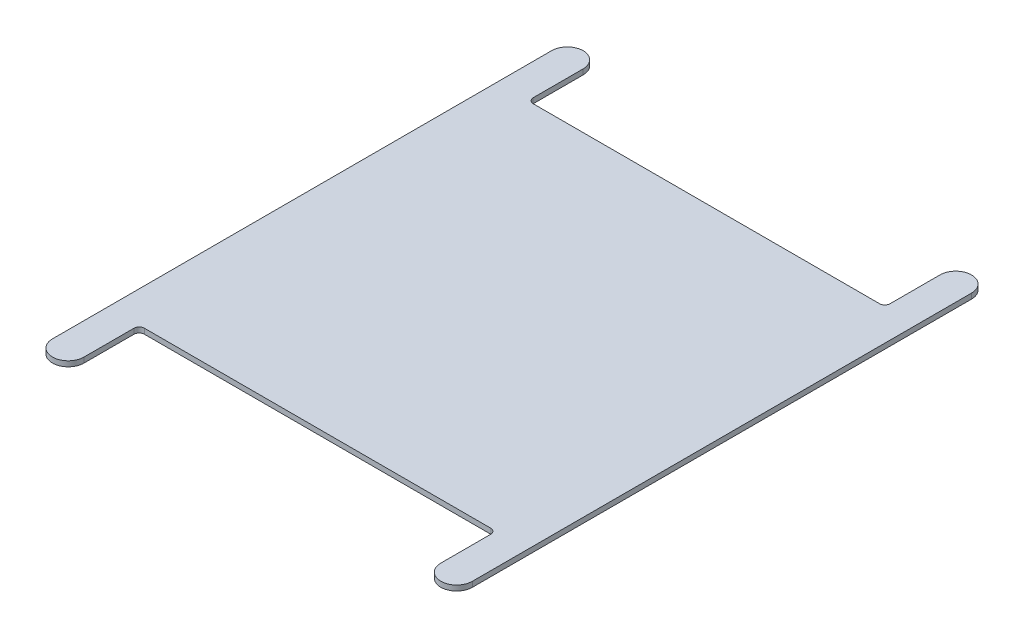
ISO-10303-21;
HEADER;
FILE_DESCRIPTION(('STEP AP214'),'2;1');
FILE_NAME('part.step','',(''),(''),'','','');
FILE_SCHEMA(('AUTOMOTIVE_DESIGN { 1 0 10303 214 1 1 1 1 }'));
ENDSEC;
DATA;
#1=APPLICATION_CONTEXT('core data for automotive mechanical design processes');
#2=APPLICATION_PROTOCOL_DEFINITION('international standard','automotive_design',2000,#1);
#3=PRODUCT_CONTEXT('',#1,'mechanical');
#4=PRODUCT('Part','Part','',(#3));
#5=PRODUCT_RELATED_PRODUCT_CATEGORY('part','',(#4));
#6=PRODUCT_DEFINITION_FORMATION('','',#4);
#7=PRODUCT_DEFINITION_CONTEXT('part definition',#1,'design');
#8=PRODUCT_DEFINITION('design','',#6,#7);
#9=PRODUCT_DEFINITION_SHAPE('','',#8);
#10=(LENGTH_UNIT() NAMED_UNIT(*) SI_UNIT(.MILLI.,.METRE.));
#11=(NAMED_UNIT(*) PLANE_ANGLE_UNIT() SI_UNIT($,.RADIAN.));
#12=(NAMED_UNIT(*) SI_UNIT($,.STERADIAN.) SOLID_ANGLE_UNIT());
#13=UNCERTAINTY_MEASURE_WITH_UNIT(LENGTH_MEASURE(1.E-05),#10,'distance_accuracy_value','');
#14=(GEOMETRIC_REPRESENTATION_CONTEXT(3) GLOBAL_UNCERTAINTY_ASSIGNED_CONTEXT((#13)) GLOBAL_UNIT_ASSIGNED_CONTEXT((#10,
#11,#12)) REPRESENTATION_CONTEXT('',''));
#15=CARTESIAN_POINT('',(0.,0.,0.));
#16=DIRECTION('',(0.,0.,1.));
#17=DIRECTION('',(1.,0.,0.));
#18=AXIS2_PLACEMENT_3D('',#15,#16,#17);
#19=CARTESIAN_POINT('',(107.823062484,128.902574554,1069.712834154));
#20=DIRECTION('',(1.,0.,0.));
#21=DIRECTION('',(0.,0.,-1.));
#22=AXIS2_PLACEMENT_3D('',#19,#20,#21);
#23=PLANE('',#22);
#24=DIRECTION('',(0.,0.,-1.));
#25=VECTOR('',#24,1.);
#26=CARTESIAN_POINT('',(107.823062484,128.902574554,1069.712834154));
#27=LINE('',#26,#25);
#28=CARTESIAN_POINT('',(107.823062484,128.902574554,1099.875334154));
#29=VERTEX_POINT('',#28);
#30=CARTESIAN_POINT('',(107.823062484,128.902574554,1069.712834154));
#31=VERTEX_POINT('',#30);
#32=EDGE_CURVE('E184',#29,#31,#27,.T.);
#33=ORIENTED_EDGE('',*,*,#32,.F.);
#34=DIRECTION('',(0.,1.,0.));
#35=VECTOR('',#34,1.);
#36=CARTESIAN_POINT('',(107.823062484,132.077574554,1099.875334154));
#37=LINE('',#36,#35);
#38=CARTESIAN_POINT('',(107.823062484,132.077574554,1099.875334154));
#39=VERTEX_POINT('',#38);
#40=EDGE_CURVE('E242',#29,#39,#37,.T.);
#41=ORIENTED_EDGE('',*,*,#40,.T.);
#42=DIRECTION('',(0.,0.,-1.));
#43=VECTOR('',#42,1.);
#44=CARTESIAN_POINT('',(107.823062484,132.077574554,1069.712834154));
#45=LINE('',#44,#43);
#46=CARTESIAN_POINT('',(107.823062484,132.077574554,1069.712834154));
#47=VERTEX_POINT('',#46);
#48=EDGE_CURVE('E175',#39,#47,#45,.T.);
#49=ORIENTED_EDGE('',*,*,#48,.T.);
#50=DIRECTION('',(0.,1.,0.));
#51=VECTOR('',#50,1.);
#52=CARTESIAN_POINT('',(107.823062484,128.902574554,1069.712834154));
#53=LINE('',#52,#51);
#54=EDGE_CURVE('E223',#31,#47,#53,.T.);
#55=ORIENTED_EDGE('',*,*,#54,.F.);
#56=EDGE_LOOP('',(#33,#41,#49,#55));
#57=FACE_BOUND('',#56,.T.);
#58=ADVANCED_FACE('F39',(#57),#23,.F.);
#59=CARTESIAN_POINT('',(117.348062484,128.902574554,1069.712834154));
#60=DIRECTION('',(0.,1.,0.));
#61=DIRECTION('',(0.,0.,1.));
#62=AXIS2_PLACEMENT_3D('',#59,#60,#61);
#63=CYLINDRICAL_SURFACE('',#62,9.52499999999979);
#64=CARTESIAN_POINT('',(117.348062484,132.077574554,1069.712834154));
#65=DIRECTION('',(0.,-1.,0.));
#66=DIRECTION('',(0.,0.,-1.));
#67=AXIS2_PLACEMENT_3D('',#64,#65,#66);
#68=CIRCLE('',#67,9.52499999999979);
#69=CARTESIAN_POINT('',(126.873062484,132.077574554,1069.712834154));
#70=VERTEX_POINT('',#69);
#71=EDGE_CURVE('E178',#47,#70,#68,.T.);
#72=ORIENTED_EDGE('',*,*,#71,.T.);
#73=DIRECTION('',(0.,1.,0.));
#74=VECTOR('',#73,1.);
#75=CARTESIAN_POINT('',(126.873062484,128.902574554,1069.712834154));
#76=LINE('',#75,#74);
#77=CARTESIAN_POINT('',(126.873062484,128.902574554,1069.712834154));
#78=VERTEX_POINT('',#77);
#79=EDGE_CURVE('E220',#78,#70,#76,.T.);
#80=ORIENTED_EDGE('',*,*,#79,.F.);
#81=CARTESIAN_POINT('',(117.348062484,128.902574554,1069.712834154));
#82=DIRECTION('',(0.,-1.,0.));
#83=DIRECTION('',(0.,0.,-1.));
#84=AXIS2_PLACEMENT_3D('',#81,#82,#83);
#85=CIRCLE('',#84,9.52499999999979);
#86=EDGE_CURVE('E186',#31,#78,#85,.T.);
#87=ORIENTED_EDGE('',*,*,#86,.F.);
#88=ORIENTED_EDGE('',*,*,#54,.T.);
#89=EDGE_LOOP('',(#72,#80,#87,#88));
#90=FACE_BOUND('',#89,.T.);
#91=ADVANCED_FACE('F269',(#90),#63,.T.);
#92=CARTESIAN_POINT('',(126.873062484,128.902574554,1371.337834154));
#93=DIRECTION('',(-1.,0.,0.));
#94=DIRECTION('',(0.,0.,1.));
#95=AXIS2_PLACEMENT_3D('',#92,#93,#94);
#96=PLANE('',#95);
#97=DIRECTION('',(0.,0.,1.));
#98=VECTOR('',#97,1.);
#99=CARTESIAN_POINT('',(126.873062484,132.077574554,1371.337834154));
#100=LINE('',#99,#98);
#101=CARTESIAN_POINT('',(126.873062484,132.077574554,1371.337834154));
#102=VERTEX_POINT('',#101);
#103=EDGE_CURVE('E203',#70,#102,#100,.T.);
#104=ORIENTED_EDGE('',*,*,#103,.T.);
#105=DIRECTION('',(0.,1.,0.));
#106=VECTOR('',#105,1.);
#107=CARTESIAN_POINT('',(126.873062484,128.902574554,1371.337834154));
#108=LINE('',#107,#106);
#109=CARTESIAN_POINT('',(126.873062484,128.902574554,1371.337834154));
#110=VERTEX_POINT('',#109);
#111=EDGE_CURVE('E217',#110,#102,#108,.T.);
#112=ORIENTED_EDGE('',*,*,#111,.F.);
#113=DIRECTION('',(0.,0.,1.));
#114=VECTOR('',#113,1.);
#115=CARTESIAN_POINT('',(126.873062484,128.902574554,1371.337834154));
#116=LINE('',#115,#114);
#117=EDGE_CURVE('E189',#78,#110,#116,.T.);
#118=ORIENTED_EDGE('',*,*,#117,.F.);
#119=ORIENTED_EDGE('',*,*,#79,.T.);
#120=EDGE_LOOP('',(#104,#112,#118,#119));
#121=FACE_BOUND('',#120,.T.);
#122=ADVANCED_FACE('F274',(#121),#96,.F.);
#123=CARTESIAN_POINT('',(117.348062484,128.902574554,1371.337834154));
#124=DIRECTION('',(0.,1.,0.));
#125=DIRECTION('',(0.,0.,1.));
#126=AXIS2_PLACEMENT_3D('',#123,#124,#125);
#127=CYLINDRICAL_SURFACE('',#126,9.52499999999979);
#128=CARTESIAN_POINT('',(117.348062484,132.077574554,1371.337834154));
#129=DIRECTION('',(0.,-1.,0.));
#130=DIRECTION('',(0.,0.,-1.));
#131=AXIS2_PLACEMENT_3D('',#128,#129,#130);
#132=CIRCLE('',#131,9.52499999999979);
#133=CARTESIAN_POINT('',(107.823062484,132.077574554,1371.337834154));
#134=VERTEX_POINT('',#133);
#135=EDGE_CURVE('E205',#102,#134,#132,.T.);
#136=ORIENTED_EDGE('',*,*,#135,.T.);
#137=DIRECTION('',(0.,1.,0.));
#138=VECTOR('',#137,1.);
#139=CARTESIAN_POINT('',(107.823062484,128.902574554,1371.337834154));
#140=LINE('',#139,#138);
#141=CARTESIAN_POINT('',(107.823062484,128.902574554,1371.337834154));
#142=VERTEX_POINT('',#141);
#143=EDGE_CURVE('E200',#142,#134,#140,.T.);
#144=ORIENTED_EDGE('',*,*,#143,.F.);
#145=CARTESIAN_POINT('',(117.348062484,128.902574554,1371.337834154));
#146=DIRECTION('',(0.,-1.,0.));
#147=DIRECTION('',(0.,0.,-1.));
#148=AXIS2_PLACEMENT_3D('',#145,#146,#147);
#149=CIRCLE('',#148,9.52499999999979);
#150=EDGE_CURVE('E191',#110,#142,#149,.T.);
#151=ORIENTED_EDGE('',*,*,#150,.F.);
#152=ORIENTED_EDGE('',*,*,#111,.T.);
#153=EDGE_LOOP('',(#136,#144,#151,#152));
#154=FACE_BOUND('',#153,.T.);
#155=ADVANCED_FACE('F280',(#154),#127,.T.);
#156=CARTESIAN_POINT('',(107.823062484,128.902574554,1338.000334154));
#157=DIRECTION('',(1.,0.,0.));
#158=DIRECTION('',(0.,0.,-1.));
#159=AXIS2_PLACEMENT_3D('',#156,#157,#158);
#160=PLANE('',#159);
#161=DIRECTION('',(0.,0.,-1.));
#162=VECTOR('',#161,1.);
#163=CARTESIAN_POINT('',(107.823062484,132.077574554,1338.000334154));
#164=LINE('',#163,#162);
#165=CARTESIAN_POINT('',(107.823062484,132.077574554,1341.175334154));
#166=VERTEX_POINT('',#165);
#167=EDGE_CURVE('E207',#134,#166,#164,.T.);
#168=ORIENTED_EDGE('',*,*,#167,.T.);
#169=DIRECTION('',(0.,1.,0.));
#170=VECTOR('',#169,1.);
#171=CARTESIAN_POINT('',(107.823062484,128.902574554,1341.175334154));
#172=LINE('',#171,#170);
#173=CARTESIAN_POINT('',(107.823062484,128.902574554,1341.175334154));
#174=VERTEX_POINT('',#173);
#175=EDGE_CURVE('E240',#166,#174,#172,.F.);
#176=ORIENTED_EDGE('',*,*,#175,.T.);
#177=DIRECTION('',(0.,0.,-1.));
#178=VECTOR('',#177,1.);
#179=CARTESIAN_POINT('',(107.823062484,128.902574554,1338.000334154));
#180=LINE('',#179,#178);
#181=EDGE_CURVE('E193',#142,#174,#180,.T.);
#182=ORIENTED_EDGE('',*,*,#181,.F.);
#183=ORIENTED_EDGE('',*,*,#143,.T.);
#184=EDGE_LOOP('',(#168,#176,#182,#183));
#185=FACE_BOUND('',#184,.T.);
#186=ADVANCED_FACE('F284',(#185),#160,.F.);
#187=CARTESIAN_POINT('',(0.,128.902574554,1338.000334154));
#188=DIRECTION('',(0.,0.,-1.));
#189=DIRECTION('',(-1.,0.,0.));
#190=AXIS2_PLACEMENT_3D('',#187,#188,#189);
#191=PLANE('',#190);
#192=DIRECTION('',(-1.,0.,0.));
#193=VECTOR('',#192,1.);
#194=CARTESIAN_POINT('',(0.,132.077574554,1338.000334154));
#195=LINE('',#194,#193);
#196=CARTESIAN_POINT('',(104.648062484,132.077574554,1338.000334154));
#197=VERTEX_POINT('',#196);
#198=CARTESIAN_POINT('',(-104.648062484,132.077574554,1338.000334154));
#199=VERTEX_POINT('',#198);
#200=EDGE_CURVE('E210',#197,#199,#195,.T.);
#201=ORIENTED_EDGE('',*,*,#200,.T.);
#202=DIRECTION('',(0.,1.,0.));
#203=VECTOR('',#202,1.);
#204=CARTESIAN_POINT('',(-104.648062484,128.902574554,1338.000334154));
#205=LINE('',#204,#203);
#206=CARTESIAN_POINT('',(-104.648062484,128.902574554,1338.000334154));
#207=VERTEX_POINT('',#206);
#208=EDGE_CURVE('E238',#199,#207,#205,.F.);
#209=ORIENTED_EDGE('',*,*,#208,.T.);
#210=DIRECTION('',(-1.,0.,0.));
#211=VECTOR('',#210,1.);
#212=CARTESIAN_POINT('',(0.,128.902574554,1338.000334154));
#213=LINE('',#212,#211);
#214=CARTESIAN_POINT('',(104.648062484,128.902574554,1338.000334154));
#215=VERTEX_POINT('',#214);
#216=EDGE_CURVE('E196',#215,#207,#213,.T.);
#217=ORIENTED_EDGE('',*,*,#216,.F.);
#218=DIRECTION('',(0.,1.,0.));
#219=VECTOR('',#218,1.);
#220=CARTESIAN_POINT('',(104.648062484,132.077574554,1338.000334154));
#221=LINE('',#220,#219);
#222=EDGE_CURVE('E235',#215,#197,#221,.T.);
#223=ORIENTED_EDGE('',*,*,#222,.T.);
#224=EDGE_LOOP('',(#201,#209,#217,#223));
#225=FACE_BOUND('',#224,.T.);
#226=ADVANCED_FACE('F292',(#225),#191,.F.);
#227=CARTESIAN_POINT('',(107.823062484,128.902574554,1103.050334154));
#228=DIRECTION('',(0.,0.,1.));
#229=DIRECTION('',(1.,0.,0.));
#230=AXIS2_PLACEMENT_3D('',#227,#228,#229);
#231=PLANE('',#230);
#232=DIRECTION('',(1.,0.,0.));
#233=VECTOR('',#232,1.);
#234=CARTESIAN_POINT('',(107.823062484,128.902574554,1103.050334154));
#235=LINE('',#234,#233);
#236=CARTESIAN_POINT('',(-104.648062484,128.902574554,1103.050334154));
#237=VERTEX_POINT('',#236);
#238=CARTESIAN_POINT('',(104.648062484,128.902574554,1103.050334154));
#239=VERTEX_POINT('',#238);
#240=EDGE_CURVE('E199',#237,#239,#235,.T.);
#241=ORIENTED_EDGE('',*,*,#240,.F.);
#242=DIRECTION('',(0.,1.,0.));
#243=VECTOR('',#242,1.);
#244=CARTESIAN_POINT('',(-104.648062484,132.077574554,1103.050334154));
#245=LINE('',#244,#243);
#246=CARTESIAN_POINT('',(-104.648062484,132.077574554,1103.050334154));
#247=VERTEX_POINT('',#246);
#248=EDGE_CURVE('E228',#237,#247,#245,.T.);
#249=ORIENTED_EDGE('',*,*,#248,.T.);
#250=DIRECTION('',(1.,0.,0.));
#251=VECTOR('',#250,1.);
#252=CARTESIAN_POINT('',(107.823062484,132.077574554,1103.050334154));
#253=LINE('',#252,#251);
#254=CARTESIAN_POINT('',(104.648062484,132.077574554,1103.050334154));
#255=VERTEX_POINT('',#254);
#256=EDGE_CURVE('E187',#247,#255,#253,.T.);
#257=ORIENTED_EDGE('',*,*,#256,.T.);
#258=DIRECTION('',(0.,1.,0.));
#259=VECTOR('',#258,1.);
#260=CARTESIAN_POINT('',(104.648062484,128.902574554,1103.050334154));
#261=LINE('',#260,#259);
#262=EDGE_CURVE('E226',#255,#239,#261,.F.);
#263=ORIENTED_EDGE('',*,*,#262,.T.);
#264=EDGE_LOOP('',(#241,#249,#257,#263));
#265=FACE_BOUND('',#264,.T.);
#266=ADVANCED_FACE('F262',(#265),#231,.F.);
#267=CARTESIAN_POINT('',(117.348062484,128.902574554,1371.337834154));
#268=DIRECTION('',(0.,-1.,0.));
#269=DIRECTION('',(0.,0.,-1.));
#270=AXIS2_PLACEMENT_3D('',#267,#268,#269);
#271=PLANE('',#270);
#272=ORIENTED_EDGE('',*,*,#240,.T.);
#273=CARTESIAN_POINT('',(104.648062484,128.902574554,1099.875334154));
#274=DIRECTION('',(0.,-1.,0.));
#275=DIRECTION('',(0.,0.,-1.));
#276=AXIS2_PLACEMENT_3D('',#273,#274,#275);
#277=CIRCLE('',#276,3.175);
#278=EDGE_CURVE('E11',#239,#29,#277,.F.);
#279=ORIENTED_EDGE('',*,*,#278,.T.);
#280=ORIENTED_EDGE('',*,*,#32,.T.);
#281=ORIENTED_EDGE('',*,*,#86,.T.);
#282=ORIENTED_EDGE('',*,*,#117,.T.);
#283=ORIENTED_EDGE('',*,*,#150,.T.);
#284=ORIENTED_EDGE('',*,*,#181,.T.);
#285=CARTESIAN_POINT('',(104.648062484,128.902574554,1341.175334154));
#286=DIRECTION('',(0.,-1.,0.));
#287=DIRECTION('',(0.,0.,-1.));
#288=AXIS2_PLACEMENT_3D('',#285,#286,#287);
#289=CIRCLE('',#288,3.175);
#290=EDGE_CURVE('E254',#174,#215,#289,.F.);
#291=ORIENTED_EDGE('',*,*,#290,.T.);
#292=ORIENTED_EDGE('',*,*,#216,.T.);
#293=CARTESIAN_POINT('',(-104.648062484,128.902574554,1341.175334154));
#294=DIRECTION('',(0.,-1.,0.));
#295=DIRECTION('',(0.,0.,-1.));
#296=AXIS2_PLACEMENT_3D('',#293,#294,#295);
#297=CIRCLE('',#296,3.175);
#298=CARTESIAN_POINT('',(-107.823062484,128.902574554,1341.175334154));
#299=VERTEX_POINT('',#298);
#300=EDGE_CURVE('E250',#207,#299,#297,.F.);
#301=ORIENTED_EDGE('',*,*,#300,.T.);
#302=DIRECTION('',(0.,0.,-1.));
#303=VECTOR('',#302,1.);
#304=CARTESIAN_POINT('',(-107.823062484,128.902574554,1338.000334154));
#305=LINE('',#304,#303);
#306=CARTESIAN_POINT('',(-107.823062484,128.902574554,1371.337834154));
#307=VERTEX_POINT('',#306);
#308=EDGE_CURVE('E299',#307,#299,#305,.T.);
#309=ORIENTED_EDGE('',*,*,#308,.F.);
#310=CARTESIAN_POINT('',(-117.348062484,128.902574554,1371.337834154));
#311=DIRECTION('',(0.,1.,0.));
#312=DIRECTION('',(0.,0.,-1.));
#313=AXIS2_PLACEMENT_3D('',#310,#311,#312);
#314=CIRCLE('',#313,9.52499999999979);
#315=CARTESIAN_POINT('',(-126.873062484,128.902574554,1371.337834154));
#316=VERTEX_POINT('',#315);
#317=EDGE_CURVE('E307',#316,#307,#314,.T.);
#318=ORIENTED_EDGE('',*,*,#317,.F.);
#319=DIRECTION('',(0.,0.,1.));
#320=VECTOR('',#319,1.);
#321=CARTESIAN_POINT('',(-126.873062484,128.902574554,1371.337834154));
#322=LINE('',#321,#320);
#323=CARTESIAN_POINT('',(-126.873062484,128.902574554,1069.712834154));
#324=VERTEX_POINT('',#323);
#325=EDGE_CURVE('E166',#324,#316,#322,.T.);
#326=ORIENTED_EDGE('',*,*,#325,.F.);
#327=CARTESIAN_POINT('',(-117.348062484,128.902574554,1069.712834154));
#328=DIRECTION('',(0.,1.,0.));
#329=DIRECTION('',(0.,0.,-1.));
#330=AXIS2_PLACEMENT_3D('',#327,#328,#329);
#331=CIRCLE('',#330,9.52499999999979);
#332=CARTESIAN_POINT('',(-107.823062484,128.902574554,1069.712834154));
#333=VERTEX_POINT('',#332);
#334=EDGE_CURVE('E160',#333,#324,#331,.T.);
#335=ORIENTED_EDGE('',*,*,#334,.F.);
#336=DIRECTION('',(0.,0.,-1.));
#337=VECTOR('',#336,1.);
#338=CARTESIAN_POINT('',(-107.823062484,128.902574554,1069.712834154));
#339=LINE('',#338,#337);
#340=CARTESIAN_POINT('',(-107.823062484,128.902574554,1099.875334154));
#341=VERTEX_POINT('',#340);
#342=EDGE_CURVE('E151',#341,#333,#339,.T.);
#343=ORIENTED_EDGE('',*,*,#342,.F.);
#344=CARTESIAN_POINT('',(-104.648062484,128.902574554,1099.875334154));
#345=DIRECTION('',(0.,-1.,0.));
#346=DIRECTION('',(0.,0.,-1.));
#347=AXIS2_PLACEMENT_3D('',#344,#345,#346);
#348=CIRCLE('',#347,3.175);
#349=EDGE_CURVE('E246',#341,#237,#348,.F.);
#350=ORIENTED_EDGE('',*,*,#349,.T.);
#351=EDGE_LOOP('',(#272,#279,#280,#281,#282,#283,#284,#291,#292,#301,#309,#318,#326,#335,#343,#350));
#352=FACE_BOUND('',#351,.T.);
#353=ADVANCED_FACE('F164',(#352),#271,.T.);
#354=CARTESIAN_POINT('',(117.348062484,132.077574554,1371.337834154));
#355=DIRECTION('',(0.,-1.,0.));
#356=DIRECTION('',(0.,0.,-1.));
#357=AXIS2_PLACEMENT_3D('',#354,#355,#356);
#358=PLANE('',#357);
#359=ORIENTED_EDGE('',*,*,#48,.F.);
#360=CARTESIAN_POINT('',(104.648062484,132.077574554,1099.875334154));
#361=DIRECTION('',(0.,-1.,0.));
#362=DIRECTION('',(0.,0.,-1.));
#363=AXIS2_PLACEMENT_3D('',#360,#361,#362);
#364=CIRCLE('',#363,3.175);
#365=EDGE_CURVE('E47',#39,#255,#364,.T.);
#366=ORIENTED_EDGE('',*,*,#365,.T.);
#367=ORIENTED_EDGE('',*,*,#256,.F.);
#368=CARTESIAN_POINT('',(-104.648062484,132.077574554,1099.875334154));
#369=DIRECTION('',(0.,-1.,0.));
#370=DIRECTION('',(0.,0.,-1.));
#371=AXIS2_PLACEMENT_3D('',#368,#369,#370);
#372=CIRCLE('',#371,3.175);
#373=CARTESIAN_POINT('',(-107.823062484,132.077574554,1099.875334154));
#374=VERTEX_POINT('',#373);
#375=EDGE_CURVE('E244',#247,#374,#372,.T.);
#376=ORIENTED_EDGE('',*,*,#375,.T.);
#377=DIRECTION('',(0.,0.,-1.));
#378=VECTOR('',#377,1.);
#379=CARTESIAN_POINT('',(-107.823062484,132.077574554,1069.712834154));
#380=LINE('',#379,#378);
#381=CARTESIAN_POINT('',(-107.823062484,132.077574554,1069.712834154));
#382=VERTEX_POINT('',#381);
#383=EDGE_CURVE('E313',#374,#382,#380,.T.);
#384=ORIENTED_EDGE('',*,*,#383,.T.);
#385=CARTESIAN_POINT('',(-117.348062484,132.077574554,1069.712834154));
#386=DIRECTION('',(0.,1.,0.));
#387=DIRECTION('',(0.,0.,-1.));
#388=AXIS2_PLACEMENT_3D('',#385,#386,#387);
#389=CIRCLE('',#388,9.52499999999979);
#390=CARTESIAN_POINT('',(-126.873062484,132.077574554,1069.712834154));
#391=VERTEX_POINT('',#390);
#392=EDGE_CURVE('E174',#382,#391,#389,.T.);
#393=ORIENTED_EDGE('',*,*,#392,.T.);
#394=DIRECTION('',(0.,0.,1.));
#395=VECTOR('',#394,1.);
#396=CARTESIAN_POINT('',(-126.873062484,132.077574554,1371.337834154));
#397=LINE('',#396,#395);
#398=CARTESIAN_POINT('',(-126.873062484,132.077574554,1371.337834154));
#399=VERTEX_POINT('',#398);
#400=EDGE_CURVE('E316',#391,#399,#397,.T.);
#401=ORIENTED_EDGE('',*,*,#400,.T.);
#402=CARTESIAN_POINT('',(-117.348062484,132.077574554,1371.337834154));
#403=DIRECTION('',(0.,1.,0.));
#404=DIRECTION('',(0.,0.,-1.));
#405=AXIS2_PLACEMENT_3D('',#402,#403,#404);
#406=CIRCLE('',#405,9.52499999999979);
#407=CARTESIAN_POINT('',(-107.823062484,132.077574554,1371.337834154));
#408=VERTEX_POINT('',#407);
#409=EDGE_CURVE('E319',#399,#408,#406,.T.);
#410=ORIENTED_EDGE('',*,*,#409,.T.);
#411=DIRECTION('',(0.,0.,-1.));
#412=VECTOR('',#411,1.);
#413=CARTESIAN_POINT('',(-107.823062484,132.077574554,1338.000334154));
#414=LINE('',#413,#412);
#415=CARTESIAN_POINT('',(-107.823062484,132.077574554,1341.175334154));
#416=VERTEX_POINT('',#415);
#417=EDGE_CURVE('E161',#408,#416,#414,.T.);
#418=ORIENTED_EDGE('',*,*,#417,.T.);
#419=CARTESIAN_POINT('',(-104.648062484,132.077574554,1341.175334154));
#420=DIRECTION('',(0.,-1.,0.));
#421=DIRECTION('',(0.,0.,-1.));
#422=AXIS2_PLACEMENT_3D('',#419,#420,#421);
#423=CIRCLE('',#422,3.175);
#424=EDGE_CURVE('E248',#416,#199,#423,.T.);
#425=ORIENTED_EDGE('',*,*,#424,.T.);
#426=ORIENTED_EDGE('',*,*,#200,.F.);
#427=CARTESIAN_POINT('',(104.648062484,132.077574554,1341.175334154));
#428=DIRECTION('',(0.,-1.,0.));
#429=DIRECTION('',(0.,0.,-1.));
#430=AXIS2_PLACEMENT_3D('',#427,#428,#429);
#431=CIRCLE('',#430,3.175);
#432=EDGE_CURVE('E252',#197,#166,#431,.T.);
#433=ORIENTED_EDGE('',*,*,#432,.T.);
#434=ORIENTED_EDGE('',*,*,#167,.F.);
#435=ORIENTED_EDGE('',*,*,#135,.F.);
#436=ORIENTED_EDGE('',*,*,#103,.F.);
#437=ORIENTED_EDGE('',*,*,#71,.F.);
#438=EDGE_LOOP('',(#359,#366,#367,#376,#384,#393,#401,#410,#418,#425,#426,#433,#434,#435,#436,#437));
#439=FACE_BOUND('',#438,.T.);
#440=ADVANCED_FACE('F258',(#439),#358,.F.);
#441=CARTESIAN_POINT('',(-107.823062484,128.902574554,1069.712834154));
#442=DIRECTION('',(-1.,0.,0.));
#443=DIRECTION('',(0.,0.,-1.));
#444=AXIS2_PLACEMENT_3D('',#441,#442,#443);
#445=PLANE('',#444);
#446=ORIENTED_EDGE('',*,*,#383,.F.);
#447=DIRECTION('',(0.,1.,0.));
#448=VECTOR('',#447,1.);
#449=CARTESIAN_POINT('',(-107.823062484,128.902574554,1099.875334154));
#450=LINE('',#449,#448);
#451=EDGE_CURVE('E158',#374,#341,#450,.F.);
#452=ORIENTED_EDGE('',*,*,#451,.T.);
#453=ORIENTED_EDGE('',*,*,#342,.T.);
#454=DIRECTION('',(0.,1.,0.));
#455=VECTOR('',#454,1.);
#456=CARTESIAN_POINT('',(-107.823062484,128.902574554,1069.712834154));
#457=LINE('',#456,#455);
#458=EDGE_CURVE('E156',#333,#382,#457,.T.);
#459=ORIENTED_EDGE('',*,*,#458,.T.);
#460=EDGE_LOOP('',(#446,#452,#453,#459));
#461=FACE_BOUND('',#460,.T.);
#462=ADVANCED_FACE('F154',(#461),#445,.F.);
#463=CARTESIAN_POINT('',(-117.348062484,128.902574554,1069.712834154));
#464=DIRECTION('',(0.,1.,0.));
#465=DIRECTION('',(0.,0.,1.));
#466=AXIS2_PLACEMENT_3D('',#463,#464,#465);
#467=CYLINDRICAL_SURFACE('',#466,9.52499999999979);
#468=ORIENTED_EDGE('',*,*,#392,.F.);
#469=ORIENTED_EDGE('',*,*,#458,.F.);
#470=ORIENTED_EDGE('',*,*,#334,.T.);
#471=DIRECTION('',(0.,1.,0.));
#472=VECTOR('',#471,1.);
#473=CARTESIAN_POINT('',(-126.873062484,128.902574554,1069.712834154));
#474=LINE('',#473,#472);
#475=EDGE_CURVE('E176',#324,#391,#474,.T.);
#476=ORIENTED_EDGE('',*,*,#475,.T.);
#477=EDGE_LOOP('',(#468,#469,#470,#476));
#478=FACE_BOUND('',#477,.T.);
#479=ADVANCED_FACE('F172',(#478),#467,.T.);
#480=CARTESIAN_POINT('',(-126.873062484,128.902574554,1371.337834154));
#481=DIRECTION('',(1.,0.,0.));
#482=DIRECTION('',(0.,0.,1.));
#483=AXIS2_PLACEMENT_3D('',#480,#481,#482);
#484=PLANE('',#483);
#485=ORIENTED_EDGE('',*,*,#400,.F.);
#486=ORIENTED_EDGE('',*,*,#475,.F.);
#487=ORIENTED_EDGE('',*,*,#325,.T.);
#488=DIRECTION('',(0.,1.,0.));
#489=VECTOR('',#488,1.);
#490=CARTESIAN_POINT('',(-126.873062484,128.902574554,1371.337834154));
#491=LINE('',#490,#489);
#492=EDGE_CURVE('E180',#316,#399,#491,.T.);
#493=ORIENTED_EDGE('',*,*,#492,.T.);
#494=EDGE_LOOP('',(#485,#486,#487,#493));
#495=FACE_BOUND('',#494,.T.);
#496=ADVANCED_FACE('F325',(#495),#484,.F.);
#497=CARTESIAN_POINT('',(-117.348062484,128.902574554,1371.337834154));
#498=DIRECTION('',(0.,1.,0.));
#499=DIRECTION('',(0.,0.,1.));
#500=AXIS2_PLACEMENT_3D('',#497,#498,#499);
#501=CYLINDRICAL_SURFACE('',#500,9.52499999999979);
#502=ORIENTED_EDGE('',*,*,#409,.F.);
#503=ORIENTED_EDGE('',*,*,#492,.F.);
#504=ORIENTED_EDGE('',*,*,#317,.T.);
#505=DIRECTION('',(0.,1.,0.));
#506=VECTOR('',#505,1.);
#507=CARTESIAN_POINT('',(-107.823062484,128.902574554,1371.337834154));
#508=LINE('',#507,#506);
#509=EDGE_CURVE('E305',#307,#408,#508,.T.);
#510=ORIENTED_EDGE('',*,*,#509,.T.);
#511=EDGE_LOOP('',(#502,#503,#504,#510));
#512=FACE_BOUND('',#511,.T.);
#513=ADVANCED_FACE('F336',(#512),#501,.T.);
#514=CARTESIAN_POINT('',(-107.823062484,128.902574554,1338.000334154));
#515=DIRECTION('',(-1.,0.,0.));
#516=DIRECTION('',(0.,0.,-1.));
#517=AXIS2_PLACEMENT_3D('',#514,#515,#516);
#518=PLANE('',#517);
#519=ORIENTED_EDGE('',*,*,#308,.T.);
#520=DIRECTION('',(0.,1.,0.));
#521=VECTOR('',#520,1.);
#522=CARTESIAN_POINT('',(-107.823062484,132.077574554,1341.175334154));
#523=LINE('',#522,#521);
#524=EDGE_CURVE('E232',#299,#416,#523,.T.);
#525=ORIENTED_EDGE('',*,*,#524,.T.);
#526=ORIENTED_EDGE('',*,*,#417,.F.);
#527=ORIENTED_EDGE('',*,*,#509,.F.);
#528=EDGE_LOOP('',(#519,#525,#526,#527));
#529=FACE_BOUND('',#528,.T.);
#530=ADVANCED_FACE('F302',(#529),#518,.F.);
#531=CARTESIAN_POINT('',(-104.648062484,128.902574554,1099.875334154));
#532=DIRECTION('',(0.,-1.,0.));
#533=DIRECTION('',(0.,0.,-1.));
#534=AXIS2_PLACEMENT_3D('',#531,#532,#533);
#535=CYLINDRICAL_SURFACE('',#534,3.175);
#536=ORIENTED_EDGE('',*,*,#349,.F.);
#537=ORIENTED_EDGE('',*,*,#451,.F.);
#538=ORIENTED_EDGE('',*,*,#375,.F.);
#539=ORIENTED_EDGE('',*,*,#248,.F.);
#540=EDGE_LOOP('',(#536,#537,#538,#539));
#541=FACE_BOUND('',#540,.T.);
#542=ADVANCED_FACE('F328',(#541),#535,.F.);
#543=CARTESIAN_POINT('',(-104.648062484,128.902574554,1341.175334154));
#544=DIRECTION('',(0.,-1.,0.));
#545=DIRECTION('',(0.,0.,-1.));
#546=AXIS2_PLACEMENT_3D('',#543,#544,#545);
#547=CYLINDRICAL_SURFACE('',#546,3.175);
#548=ORIENTED_EDGE('',*,*,#300,.F.);
#549=ORIENTED_EDGE('',*,*,#208,.F.);
#550=ORIENTED_EDGE('',*,*,#424,.F.);
#551=ORIENTED_EDGE('',*,*,#524,.F.);
#552=EDGE_LOOP('',(#548,#549,#550,#551));
#553=FACE_BOUND('',#552,.T.);
#554=ADVANCED_FACE('F296',(#553),#547,.F.);
#555=CARTESIAN_POINT('',(104.648062484,128.902574554,1341.175334154));
#556=DIRECTION('',(0.,-1.,0.));
#557=DIRECTION('',(0.,0.,-1.));
#558=AXIS2_PLACEMENT_3D('',#555,#556,#557);
#559=CYLINDRICAL_SURFACE('',#558,3.175);
#560=ORIENTED_EDGE('',*,*,#290,.F.);
#561=ORIENTED_EDGE('',*,*,#175,.F.);
#562=ORIENTED_EDGE('',*,*,#432,.F.);
#563=ORIENTED_EDGE('',*,*,#222,.F.);
#564=EDGE_LOOP('',(#560,#561,#562,#563));
#565=FACE_BOUND('',#564,.T.);
#566=ADVANCED_FACE('F287',(#565),#559,.F.);
#567=CARTESIAN_POINT('',(104.648062484,128.902574554,1099.875334154));
#568=DIRECTION('',(0.,-1.,0.));
#569=DIRECTION('',(0.,0.,-1.));
#570=AXIS2_PLACEMENT_3D('',#567,#568,#569);
#571=CYLINDRICAL_SURFACE('',#570,3.175);
#572=ORIENTED_EDGE('',*,*,#278,.F.);
#573=ORIENTED_EDGE('',*,*,#262,.F.);
#574=ORIENTED_EDGE('',*,*,#365,.F.);
#575=ORIENTED_EDGE('',*,*,#40,.F.);
#576=EDGE_LOOP('',(#572,#573,#574,#575));
#577=FACE_BOUND('',#576,.T.);
#578=ADVANCED_FACE('F41',(#577),#571,.F.);
#579=CLOSED_SHELL('',(#58,#91,#122,#155,#186,#226,#266,#353,#440,#462,#479,#496,#513,#530,#542,
#554,#566,#578));
#580=MANIFOLD_SOLID_BREP('B2',#579);
#581=ADVANCED_BREP_SHAPE_REPRESENTATION('',(#18,#580),#14);
#582=SHAPE_DEFINITION_REPRESENTATION(#9,#581);
ENDSEC;
END-ISO-10303-21;
